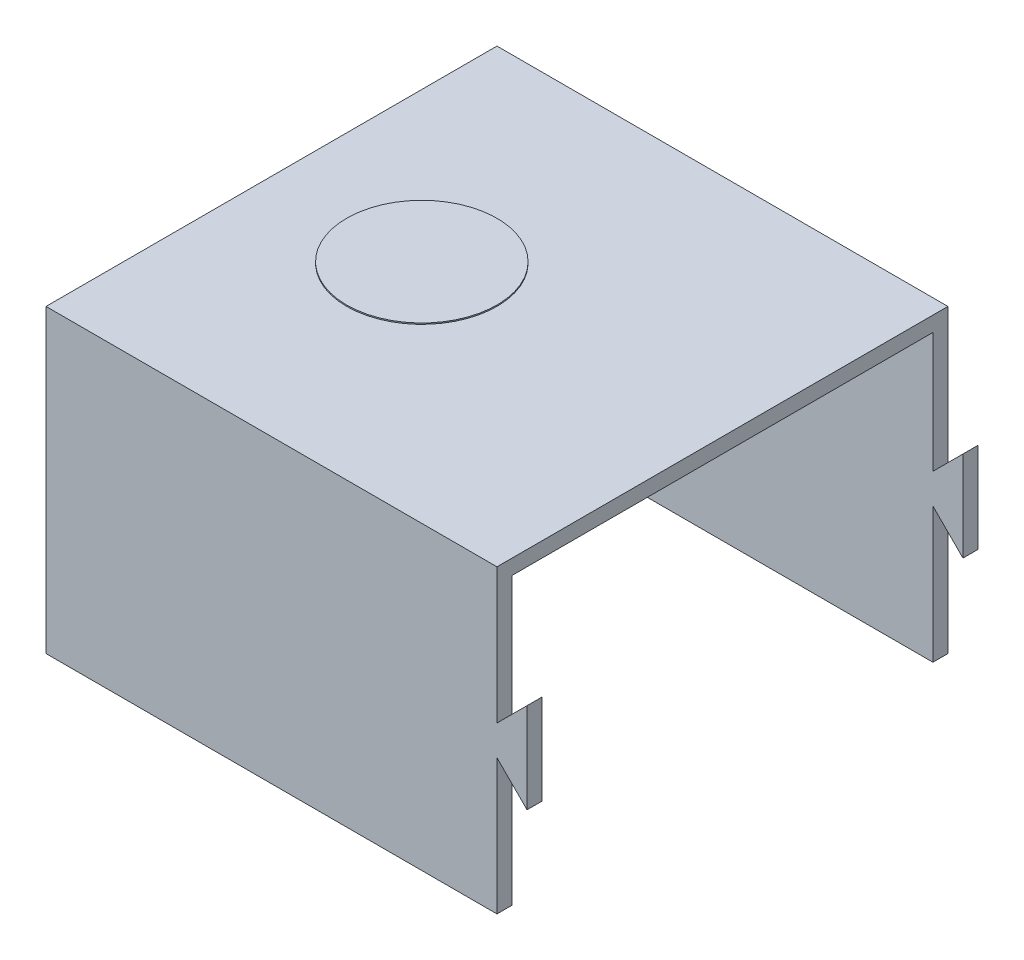
ISO-10303-21;
HEADER;
FILE_DESCRIPTION(('STEP AP214'),'2;1');
FILE_NAME('part.step','',(''),(''),'','','');
FILE_SCHEMA(('AUTOMOTIVE_DESIGN { 1 0 10303 214 1 1 1 1 }'));
ENDSEC;
DATA;
#1=APPLICATION_CONTEXT('core data for automotive mechanical design processes');
#2=APPLICATION_PROTOCOL_DEFINITION('international standard','automotive_design',2000,#1);
#3=PRODUCT_CONTEXT('',#1,'mechanical');
#4=PRODUCT('Part','Part','',(#3));
#5=PRODUCT_RELATED_PRODUCT_CATEGORY('part','',(#4));
#6=PRODUCT_DEFINITION_FORMATION('','',#4);
#7=PRODUCT_DEFINITION_CONTEXT('part definition',#1,'design');
#8=PRODUCT_DEFINITION('design','',#6,#7);
#9=PRODUCT_DEFINITION_SHAPE('','',#8);
#10=(LENGTH_UNIT() NAMED_UNIT(*) SI_UNIT(.MILLI.,.METRE.));
#11=(NAMED_UNIT(*) PLANE_ANGLE_UNIT() SI_UNIT($,.RADIAN.));
#12=(NAMED_UNIT(*) SI_UNIT($,.STERADIAN.) SOLID_ANGLE_UNIT());
#13=UNCERTAINTY_MEASURE_WITH_UNIT(LENGTH_MEASURE(1.E-05),#10,'distance_accuracy_value','');
#14=(GEOMETRIC_REPRESENTATION_CONTEXT(3) GLOBAL_UNCERTAINTY_ASSIGNED_CONTEXT((#13)) GLOBAL_UNIT_ASSIGNED_CONTEXT((#10,
#11,#12)) REPRESENTATION_CONTEXT('',''));
#15=CARTESIAN_POINT('',(0.,0.,0.));
#16=DIRECTION('',(0.,0.,1.));
#17=DIRECTION('',(1.,0.,0.));
#18=AXIS2_PLACEMENT_3D('',#15,#16,#17);
#19=CARTESIAN_POINT('',(31.8706697459584,100.,-58.0254041570439));
#20=DIRECTION('',(-1.,0.,0.));
#21=DIRECTION('',(0.,0.,1.));
#22=AXIS2_PLACEMENT_3D('',#19,#20,#21);
#23=PLANE('',#22);
#24=DIRECTION('',(0.,-1.,0.));
#25=VECTOR('',#24,1.);
#26=CARTESIAN_POINT('',(31.8706697459584,100.,-58.0254041570439));
#27=LINE('',#26,#25);
#28=CARTESIAN_POINT('',(31.8706697459584,45.,-58.0254041570439));
#29=VERTEX_POINT('',#28);
#30=CARTESIAN_POINT('',(31.8706697459584,0.,-58.0254041570439));
#31=VERTEX_POINT('',#30);
#32=EDGE_CURVE('E229',#29,#31,#27,.T.);
#33=ORIENTED_EDGE('',*,*,#32,.F.);
#34=DIRECTION('',(0.,0.,-1.));
#35=VECTOR('',#34,1.);
#36=CARTESIAN_POINT('',(31.8706697459584,45.,-53.0254041570439));
#37=LINE('',#36,#35);
#38=CARTESIAN_POINT('',(31.8706697459584,45.,-53.0254041570439));
#39=VERTEX_POINT('',#38);
#40=EDGE_CURVE('E173',#39,#29,#37,.T.);
#41=ORIENTED_EDGE('',*,*,#40,.F.);
#42=DIRECTION('',(0.,-1.,0.));
#43=VECTOR('',#42,1.);
#44=CARTESIAN_POINT('',(31.8706697459585,95.,-53.0254041570439));
#45=LINE('',#44,#43);
#46=CARTESIAN_POINT('',(31.8706697459585,0.,-53.0254041570439));
#47=VERTEX_POINT('',#46);
#48=EDGE_CURVE('E192',#39,#47,#45,.T.);
#49=ORIENTED_EDGE('',*,*,#48,.T.);
#50=DIRECTION('',(0.,0.,-1.));
#51=VECTOR('',#50,1.);
#52=CARTESIAN_POINT('',(31.8706697459584,0.,-58.0254041570439));
#53=LINE('',#52,#51);
#54=EDGE_CURVE('E223',#47,#31,#53,.T.);
#55=ORIENTED_EDGE('',*,*,#54,.T.);
#56=EDGE_LOOP('',(#33,#41,#49,#55));
#57=FACE_BOUND('',#56,.T.);
#58=ADVANCED_FACE('F39',(#57),#23,.F.);
#59=CARTESIAN_POINT('',(31.8706697459585,95.,-53.0254041570439));
#60=VERTEX_POINT('',#59);
#61=CARTESIAN_POINT('',(31.8706697459584,55.,-53.0254041570439));
#62=VERTEX_POINT('',#61);
#63=EDGE_CURVE('E180',#60,#62,#45,.T.);
#64=ORIENTED_EDGE('',*,*,#63,.T.);
#65=DIRECTION('',(0.,0.,-1.));
#66=VECTOR('',#65,1.);
#67=CARTESIAN_POINT('',(31.8706697459584,55.,-53.0254041570439));
#68=LINE('',#67,#66);
#69=CARTESIAN_POINT('',(31.8706697459584,55.,-58.0254041570439));
#70=VERTEX_POINT('',#69);
#71=EDGE_CURVE('E162',#62,#70,#68,.T.);
#72=ORIENTED_EDGE('',*,*,#71,.T.);
#73=CARTESIAN_POINT('',(31.8706697459584,100.,-58.0254041570439));
#74=VERTEX_POINT('',#73);
#75=EDGE_CURVE('E230',#74,#70,#27,.T.);
#76=ORIENTED_EDGE('',*,*,#75,.F.);
#77=DIRECTION('',(0.,0.,-1.));
#78=VECTOR('',#77,1.);
#79=CARTESIAN_POINT('',(31.8706697459584,100.,-58.0254041570439));
#80=LINE('',#79,#78);
#81=CARTESIAN_POINT('',(31.8706697459584,100.,91.9745958429561));
#82=VERTEX_POINT('',#81);
#83=EDGE_CURVE('E214',#82,#74,#80,.T.);
#84=ORIENTED_EDGE('',*,*,#83,.F.);
#85=DIRECTION('',(0.,-1.,0.));
#86=VECTOR('',#85,1.);
#87=CARTESIAN_POINT('',(31.8706697459584,100.,91.9745958429561));
#88=LINE('',#87,#86);
#89=CARTESIAN_POINT('',(31.8706697459584,55.,91.9745958429561));
#90=VERTEX_POINT('',#89);
#91=EDGE_CURVE('E47',#82,#90,#88,.T.);
#92=ORIENTED_EDGE('',*,*,#91,.T.);
#93=DIRECTION('',(0.,0.,1.));
#94=VECTOR('',#93,1.);
#95=CARTESIAN_POINT('',(31.8706697459584,55.,86.9745958429561));
#96=LINE('',#95,#94);
#97=CARTESIAN_POINT('',(31.8706697459584,55.,86.9745958429561));
#98=VERTEX_POINT('',#97);
#99=EDGE_CURVE('E253',#98,#90,#96,.T.);
#100=ORIENTED_EDGE('',*,*,#99,.F.);
#101=DIRECTION('',(0.,-1.,0.));
#102=VECTOR('',#101,1.);
#103=CARTESIAN_POINT('',(31.8706697459584,95.,86.9745958429561));
#104=LINE('',#103,#102);
#105=CARTESIAN_POINT('',(31.8706697459584,95.,86.9745958429561));
#106=VERTEX_POINT('',#105);
#107=EDGE_CURVE('E205',#106,#98,#104,.T.);
#108=ORIENTED_EDGE('',*,*,#107,.F.);
#109=DIRECTION('',(0.,0.,1.));
#110=VECTOR('',#109,1.);
#111=CARTESIAN_POINT('',(31.8706697459584,95.,86.9745958429561));
#112=LINE('',#111,#110);
#113=EDGE_CURVE('E190',#60,#106,#112,.T.);
#114=ORIENTED_EDGE('',*,*,#113,.F.);
#115=EDGE_LOOP('',(#64,#72,#76,#84,#92,#100,#108,#114));
#116=FACE_BOUND('',#115,.T.);
#117=ADVANCED_FACE('F187',(#116),#23,.F.);
#118=CARTESIAN_POINT('',(-118.129330254042,100.,-58.0254041570439));
#119=DIRECTION('',(1.,0.,0.));
#120=DIRECTION('',(0.,0.,-1.));
#121=AXIS2_PLACEMENT_3D('',#118,#119,#120);
#122=PLANE('',#121);
#123=DIRECTION('',(0.,0.,1.));
#124=VECTOR('',#123,1.);
#125=CARTESIAN_POINT('',(-118.129330254042,0.,-58.0254041570439));
#126=LINE('',#125,#124);
#127=CARTESIAN_POINT('',(-118.129330254042,0.,-58.0254041570439));
#128=VERTEX_POINT('',#127);
#129=CARTESIAN_POINT('',(-118.129330254042,0.,91.9745958429561));
#130=VERTEX_POINT('',#129);
#131=EDGE_CURVE('E209',#128,#130,#126,.T.);
#132=ORIENTED_EDGE('',*,*,#131,.T.);
#133=DIRECTION('',(0.,-1.,0.));
#134=VECTOR('',#133,1.);
#135=CARTESIAN_POINT('',(-118.129330254042,100.,91.9745958429561));
#136=LINE('',#135,#134);
#137=CARTESIAN_POINT('',(-118.129330254042,100.,91.9745958429561));
#138=VERTEX_POINT('',#137);
#139=EDGE_CURVE('E11',#138,#130,#136,.T.);
#140=ORIENTED_EDGE('',*,*,#139,.F.);
#141=DIRECTION('',(0.,0.,1.));
#142=VECTOR('',#141,1.);
#143=CARTESIAN_POINT('',(-118.129330254042,100.,-58.0254041570439));
#144=LINE('',#143,#142);
#145=CARTESIAN_POINT('',(-118.129330254042,100.,-58.0254041570439));
#146=VERTEX_POINT('',#145);
#147=EDGE_CURVE('E211',#146,#138,#144,.T.);
#148=ORIENTED_EDGE('',*,*,#147,.F.);
#149=DIRECTION('',(0.,-1.,0.));
#150=VECTOR('',#149,1.);
#151=CARTESIAN_POINT('',(-118.129330254042,100.,-58.0254041570439));
#152=LINE('',#151,#150);
#153=EDGE_CURVE('E217',#146,#128,#152,.T.);
#154=ORIENTED_EDGE('',*,*,#153,.T.);
#155=EDGE_LOOP('',(#132,#140,#148,#154));
#156=FACE_BOUND('',#155,.T.);
#157=ADVANCED_FACE('F41',(#156),#122,.F.);
#158=CARTESIAN_POINT('',(-118.129330254042,100.,91.9745958429561));
#159=DIRECTION('',(0.,0.,-1.));
#160=DIRECTION('',(-1.,0.,0.));
#161=AXIS2_PLACEMENT_3D('',#158,#159,#160);
#162=PLANE('',#161);
#163=DIRECTION('',(1.,0.,0.));
#164=VECTOR('',#163,1.);
#165=CARTESIAN_POINT('',(-118.129330254042,0.,91.9745958429561));
#166=LINE('',#165,#164);
#167=CARTESIAN_POINT('',(31.8706697459584,0.,91.9745958429561));
#168=VERTEX_POINT('',#167);
#169=EDGE_CURVE('E220',#130,#168,#166,.T.);
#170=ORIENTED_EDGE('',*,*,#169,.T.);
#171=CARTESIAN_POINT('',(31.8706697459584,45.,91.9745958429561));
#172=VERTEX_POINT('',#171);
#173=EDGE_CURVE('E231',#172,#168,#88,.T.);
#174=ORIENTED_EDGE('',*,*,#173,.F.);
#175=DIRECTION('',(0.707106781186552,-0.707106781186543,0.));
#176=VECTOR('',#175,1.);
#177=CARTESIAN_POINT('',(41.8706697459584,35.0000000000001,91.9745958429561));
#178=LINE('',#177,#176);
#179=CARTESIAN_POINT('',(41.8706697459584,35.0000000000001,91.9745958429561));
#180=VERTEX_POINT('',#179);
#181=EDGE_CURVE('E275',#172,#180,#178,.T.);
#182=ORIENTED_EDGE('',*,*,#181,.T.);
#183=DIRECTION('',(0.,1.,0.));
#184=VECTOR('',#183,1.);
#185=CARTESIAN_POINT('',(41.8706697459584,55.,91.9745958429561));
#186=LINE('',#185,#184);
#187=CARTESIAN_POINT('',(41.8706697459584,64.9999999999999,91.9745958429561));
#188=VERTEX_POINT('',#187);
#189=EDGE_CURVE('E268',#180,#188,#186,.T.);
#190=ORIENTED_EDGE('',*,*,#189,.T.);
#191=DIRECTION('',(-0.707106781186551,-0.707106781186544,0.));
#192=VECTOR('',#191,1.);
#193=CARTESIAN_POINT('',(31.8706697459584,55.,91.9745958429561));
#194=LINE('',#193,#192);
#195=EDGE_CURVE('E278',#188,#90,#194,.T.);
#196=ORIENTED_EDGE('',*,*,#195,.T.);
#197=ORIENTED_EDGE('',*,*,#91,.F.);
#198=DIRECTION('',(1.,0.,0.));
#199=VECTOR('',#198,1.);
#200=CARTESIAN_POINT('',(-118.129330254042,100.,91.9745958429561));
#201=LINE('',#200,#199);
#202=EDGE_CURVE('E90',#138,#82,#201,.T.);
#203=ORIENTED_EDGE('',*,*,#202,.F.);
#204=ORIENTED_EDGE('',*,*,#139,.T.);
#205=EDGE_LOOP('',(#170,#174,#182,#190,#196,#197,#203,#204));
#206=FACE_BOUND('',#205,.T.);
#207=ADVANCED_FACE('F242',(#206),#162,.F.);
#208=CARTESIAN_POINT('',(31.8706697459584,45.,86.9745958429561));
#209=VERTEX_POINT('',#208);
#210=CARTESIAN_POINT('',(31.8706697459584,0.,86.9745958429561));
#211=VERTEX_POINT('',#210);
#212=EDGE_CURVE('E54',#209,#211,#104,.T.);
#213=ORIENTED_EDGE('',*,*,#212,.F.);
#214=DIRECTION('',(0.,0.,1.));
#215=VECTOR('',#214,1.);
#216=CARTESIAN_POINT('',(31.8706697459584,45.,86.9745958429561));
#217=LINE('',#216,#215);
#218=EDGE_CURVE('E240',#209,#172,#217,.T.);
#219=ORIENTED_EDGE('',*,*,#218,.T.);
#220=ORIENTED_EDGE('',*,*,#173,.T.);
#221=EDGE_CURVE('E224',#168,#211,#53,.T.);
#222=ORIENTED_EDGE('',*,*,#221,.T.);
#223=EDGE_LOOP('',(#213,#219,#220,#222));
#224=FACE_BOUND('',#223,.T.);
#225=ADVANCED_FACE('F238',(#224),#23,.F.);
#226=CARTESIAN_POINT('',(-118.129330254042,100.,-58.0254041570439));
#227=DIRECTION('',(0.,0.,1.));
#228=DIRECTION('',(1.,0.,0.));
#229=AXIS2_PLACEMENT_3D('',#226,#227,#228);
#230=PLANE('',#229);
#231=DIRECTION('',(-1.,0.,0.));
#232=VECTOR('',#231,1.);
#233=CARTESIAN_POINT('',(-118.129330254042,0.,-58.0254041570439));
#234=LINE('',#233,#232);
#235=EDGE_CURVE('E83',#31,#128,#234,.T.);
#236=ORIENTED_EDGE('',*,*,#235,.T.);
#237=ORIENTED_EDGE('',*,*,#153,.F.);
#238=DIRECTION('',(-1.,0.,0.));
#239=VECTOR('',#238,1.);
#240=CARTESIAN_POINT('',(-118.129330254042,100.,-58.0254041570439));
#241=LINE('',#240,#239);
#242=EDGE_CURVE('E63',#74,#146,#241,.T.);
#243=ORIENTED_EDGE('',*,*,#242,.F.);
#244=ORIENTED_EDGE('',*,*,#75,.T.);
#245=DIRECTION('',(0.707106781186552,0.707106781186543,0.));
#246=VECTOR('',#245,1.);
#247=CARTESIAN_POINT('',(31.8706697459584,55.,-58.0254041570439));
#248=LINE('',#247,#246);
#249=CARTESIAN_POINT('',(41.8706697459584,64.9999999999999,-58.0254041570439));
#250=VERTEX_POINT('',#249);
#251=EDGE_CURVE('E168',#70,#250,#248,.T.);
#252=ORIENTED_EDGE('',*,*,#251,.T.);
#253=DIRECTION('',(0.,-1.,0.));
#254=VECTOR('',#253,1.);
#255=CARTESIAN_POINT('',(41.8706697459584,55.,-58.0254041570439));
#256=LINE('',#255,#254);
#257=CARTESIAN_POINT('',(41.8706697459584,35.0000000000001,-58.0254041570439));
#258=VERTEX_POINT('',#257);
#259=EDGE_CURVE('E288',#250,#258,#256,.T.);
#260=ORIENTED_EDGE('',*,*,#259,.T.);
#261=DIRECTION('',(-0.707106781186551,0.707106781186544,0.));
#262=VECTOR('',#261,1.);
#263=CARTESIAN_POINT('',(41.8706697459584,35.0000000000001,-58.0254041570439));
#264=LINE('',#263,#262);
#265=EDGE_CURVE('E293',#258,#29,#264,.T.);
#266=ORIENTED_EDGE('',*,*,#265,.T.);
#267=ORIENTED_EDGE('',*,*,#32,.T.);
#268=EDGE_LOOP('',(#236,#237,#243,#244,#252,#260,#266,#267));
#269=FACE_BOUND('',#268,.T.);
#270=ADVANCED_FACE('F300',(#269),#230,.F.);
#271=CARTESIAN_POINT('',(0.,100.,0.));
#272=DIRECTION('',(0.,1.,0.));
#273=DIRECTION('',(0.,0.,1.));
#274=AXIS2_PLACEMENT_3D('',#271,#272,#273);
#275=PLANE('',#274);
#276=CARTESIAN_POINT('',(-68.1293302540416,100.,16.9745958429561));
#277=DIRECTION('',(0.,1.,0.));
#278=DIRECTION('',(0.,0.,1.));
#279=AXIS2_PLACEMENT_3D('',#276,#277,#278);
#280=CIRCLE('',#279,25.);
#281=CARTESIAN_POINT('',(-68.1293302540416,100.,41.9745958429561));
#282=VERTEX_POINT('',#281);
#283=EDGE_CURVE('E191',#282,#282,#280,.T.);
#284=ORIENTED_EDGE('',*,*,#283,.F.);
#285=EDGE_LOOP('',(#284));
#286=FACE_BOUND('',#285,.T.);
#287=ORIENTED_EDGE('',*,*,#147,.T.);
#288=ORIENTED_EDGE('',*,*,#202,.T.);
#289=ORIENTED_EDGE('',*,*,#83,.T.);
#290=ORIENTED_EDGE('',*,*,#242,.T.);
#291=EDGE_LOOP('',(#287,#288,#289,#290));
#292=FACE_BOUND('',#291,.T.);
#293=ADVANCED_FACE('F301',(#286,#292),#275,.T.);
#294=CARTESIAN_POINT('',(0.,0.,0.));
#295=DIRECTION('',(0.,1.,0.));
#296=DIRECTION('',(0.,0.,1.));
#297=AXIS2_PLACEMENT_3D('',#294,#295,#296);
#298=PLANE('',#297);
#299=ORIENTED_EDGE('',*,*,#54,.F.);
#300=DIRECTION('',(1.,0.,0.));
#301=VECTOR('',#300,1.);
#302=CARTESIAN_POINT('',(31.8706697459585,0.,-53.0254041570439));
#303=LINE('',#302,#301);
#304=CARTESIAN_POINT('',(-113.129330254042,0.,-53.0254041570439));
#305=VERTEX_POINT('',#304);
#306=EDGE_CURVE('E200',#305,#47,#303,.T.);
#307=ORIENTED_EDGE('',*,*,#306,.F.);
#308=DIRECTION('',(0.,0.,-1.));
#309=VECTOR('',#308,1.);
#310=CARTESIAN_POINT('',(-113.129330254042,0.,86.9745958429561));
#311=LINE('',#310,#309);
#312=CARTESIAN_POINT('',(-113.129330254042,0.,86.9745958429561));
#313=VERTEX_POINT('',#312);
#314=EDGE_CURVE('E252',#313,#305,#311,.T.);
#315=ORIENTED_EDGE('',*,*,#314,.F.);
#316=DIRECTION('',(-1.,0.,0.));
#317=VECTOR('',#316,1.);
#318=CARTESIAN_POINT('',(31.8706697459584,0.,86.9745958429561));
#319=LINE('',#318,#317);
#320=EDGE_CURVE('E249',#211,#313,#319,.T.);
#321=ORIENTED_EDGE('',*,*,#320,.F.);
#322=ORIENTED_EDGE('',*,*,#221,.F.);
#323=ORIENTED_EDGE('',*,*,#169,.F.);
#324=ORIENTED_EDGE('',*,*,#131,.F.);
#325=ORIENTED_EDGE('',*,*,#235,.F.);
#326=EDGE_LOOP('',(#299,#307,#315,#321,#322,#323,#324,#325));
#327=FACE_BOUND('',#326,.T.);
#328=ADVANCED_FACE('F247',(#327),#298,.F.);
#329=CARTESIAN_POINT('',(-68.1293302540416,100.4,16.9745958429561));
#330=DIRECTION('',(0.,-1.,0.));
#331=DIRECTION('',(0.,0.,-1.));
#332=AXIS2_PLACEMENT_3D('',#329,#330,#331);
#333=CYLINDRICAL_SURFACE('',#332,25.);
#334=CARTESIAN_POINT('',(-68.1293302540416,100.4,16.9745958429561));
#335=DIRECTION('',(0.,1.,0.));
#336=DIRECTION('',(0.,0.,1.));
#337=AXIS2_PLACEMENT_3D('',#334,#335,#336);
#338=CIRCLE('',#337,25.);
#339=CARTESIAN_POINT('',(-68.1293302540416,100.4,41.9745958429561));
#340=VERTEX_POINT('',#339);
#341=EDGE_CURVE('E195',#340,#340,#338,.T.);
#342=ORIENTED_EDGE('',*,*,#341,.F.);
#343=EDGE_LOOP('',(#342));
#344=FACE_BOUND('',#343,.T.);
#345=ORIENTED_EDGE('',*,*,#283,.T.);
#346=EDGE_LOOP('',(#345));
#347=FACE_BOUND('',#346,.T.);
#348=ADVANCED_FACE('F370',(#344,#347),#333,.T.);
#349=CARTESIAN_POINT('',(-68.1293302540416,100.4,16.9745958429561));
#350=DIRECTION('',(0.,1.,0.));
#351=DIRECTION('',(0.,0.,1.));
#352=AXIS2_PLACEMENT_3D('',#349,#350,#351);
#353=PLANE('',#352);
#354=ORIENTED_EDGE('',*,*,#341,.T.);
#355=EDGE_LOOP('',(#354));
#356=FACE_BOUND('',#355,.T.);
#357=ADVANCED_FACE('F374',(#356),#353,.T.);
#358=CARTESIAN_POINT('',(31.8706697459585,95.,-53.0254041570439));
#359=DIRECTION('',(0.,0.,-1.));
#360=DIRECTION('',(-1.,0.,0.));
#361=AXIS2_PLACEMENT_3D('',#358,#359,#360);
#362=PLANE('',#361);
#363=ORIENTED_EDGE('',*,*,#306,.T.);
#364=ORIENTED_EDGE('',*,*,#48,.F.);
#365=DIRECTION('',(-0.707106781186551,0.707106781186544,0.));
#366=VECTOR('',#365,1.);
#367=CARTESIAN_POINT('',(41.8706697459584,35.0000000000001,-53.0254041570439));
#368=LINE('',#367,#366);
#369=CARTESIAN_POINT('',(41.8706697459584,35.0000000000001,-53.0254041570439));
#370=VERTEX_POINT('',#369);
#371=EDGE_CURVE('E291',#370,#39,#368,.T.);
#372=ORIENTED_EDGE('',*,*,#371,.F.);
#373=DIRECTION('',(0.,-1.,0.));
#374=VECTOR('',#373,1.);
#375=CARTESIAN_POINT('',(41.8706697459584,55.,-53.0254041570439));
#376=LINE('',#375,#374);
#377=CARTESIAN_POINT('',(41.8706697459584,64.9999999999999,-53.0254041570439));
#378=VERTEX_POINT('',#377);
#379=EDGE_CURVE('E174',#378,#370,#376,.T.);
#380=ORIENTED_EDGE('',*,*,#379,.F.);
#381=DIRECTION('',(0.707106781186552,0.707106781186543,0.));
#382=VECTOR('',#381,1.);
#383=CARTESIAN_POINT('',(31.8706697459584,55.,-53.0254041570439));
#384=LINE('',#383,#382);
#385=EDGE_CURVE('E166',#62,#378,#384,.T.);
#386=ORIENTED_EDGE('',*,*,#385,.F.);
#387=ORIENTED_EDGE('',*,*,#63,.F.);
#388=DIRECTION('',(1.,0.,0.));
#389=VECTOR('',#388,1.);
#390=CARTESIAN_POINT('',(31.8706697459585,95.,-53.0254041570439));
#391=LINE('',#390,#389);
#392=CARTESIAN_POINT('',(-113.129330254042,95.,-53.0254041570439));
#393=VERTEX_POINT('',#392);
#394=EDGE_CURVE('E257',#393,#60,#391,.T.);
#395=ORIENTED_EDGE('',*,*,#394,.F.);
#396=DIRECTION('',(0.,-1.,0.));
#397=VECTOR('',#396,1.);
#398=CARTESIAN_POINT('',(-113.129330254042,95.,-53.0254041570439));
#399=LINE('',#398,#397);
#400=EDGE_CURVE('E197',#393,#305,#399,.T.);
#401=ORIENTED_EDGE('',*,*,#400,.T.);
#402=EDGE_LOOP('',(#363,#364,#372,#380,#386,#387,#395,#401));
#403=FACE_BOUND('',#402,.T.);
#404=ADVANCED_FACE('F178',(#403),#362,.F.);
#405=CARTESIAN_POINT('',(-113.129330254042,95.,86.9745958429561));
#406=DIRECTION('',(-1.,0.,0.));
#407=DIRECTION('',(0.,0.,1.));
#408=AXIS2_PLACEMENT_3D('',#405,#406,#407);
#409=PLANE('',#408);
#410=ORIENTED_EDGE('',*,*,#314,.T.);
#411=ORIENTED_EDGE('',*,*,#400,.F.);
#412=DIRECTION('',(0.,0.,-1.));
#413=VECTOR('',#412,1.);
#414=CARTESIAN_POINT('',(-113.129330254042,95.,86.9745958429561));
#415=LINE('',#414,#413);
#416=CARTESIAN_POINT('',(-113.129330254042,95.,86.9745958429561));
#417=VERTEX_POINT('',#416);
#418=EDGE_CURVE('E259',#417,#393,#415,.T.);
#419=ORIENTED_EDGE('',*,*,#418,.F.);
#420=DIRECTION('',(0.,-1.,0.));
#421=VECTOR('',#420,1.);
#422=CARTESIAN_POINT('',(-113.129330254042,95.,86.9745958429561));
#423=LINE('',#422,#421);
#424=EDGE_CURVE('E203',#417,#313,#423,.T.);
#425=ORIENTED_EDGE('',*,*,#424,.T.);
#426=EDGE_LOOP('',(#410,#411,#419,#425));
#427=FACE_BOUND('',#426,.T.);
#428=ADVANCED_FACE('F314',(#427),#409,.F.);
#429=CARTESIAN_POINT('',(31.8706697459584,95.,86.9745958429561));
#430=DIRECTION('',(0.,0.,1.));
#431=DIRECTION('',(1.,0.,0.));
#432=AXIS2_PLACEMENT_3D('',#429,#430,#431);
#433=PLANE('',#432);
#434=ORIENTED_EDGE('',*,*,#320,.T.);
#435=ORIENTED_EDGE('',*,*,#424,.F.);
#436=DIRECTION('',(-1.,0.,0.));
#437=VECTOR('',#436,1.);
#438=CARTESIAN_POINT('',(31.8706697459584,95.,86.9745958429561));
#439=LINE('',#438,#437);
#440=EDGE_CURVE('E262',#106,#417,#439,.T.);
#441=ORIENTED_EDGE('',*,*,#440,.F.);
#442=ORIENTED_EDGE('',*,*,#107,.T.);
#443=DIRECTION('',(-0.707106781186551,-0.707106781186544,0.));
#444=VECTOR('',#443,1.);
#445=CARTESIAN_POINT('',(31.8706697459584,55.,86.9745958429561));
#446=LINE('',#445,#444);
#447=CARTESIAN_POINT('',(41.8706697459584,64.9999999999999,86.9745958429561));
#448=VERTEX_POINT('',#447);
#449=EDGE_CURVE('E283',#448,#98,#446,.T.);
#450=ORIENTED_EDGE('',*,*,#449,.F.);
#451=DIRECTION('',(0.,1.,0.));
#452=VECTOR('',#451,1.);
#453=CARTESIAN_POINT('',(41.8706697459584,55.,86.9745958429561));
#454=LINE('',#453,#452);
#455=CARTESIAN_POINT('',(41.8706697459584,35.0000000000001,86.9745958429561));
#456=VERTEX_POINT('',#455);
#457=EDGE_CURVE('E266',#456,#448,#454,.T.);
#458=ORIENTED_EDGE('',*,*,#457,.F.);
#459=DIRECTION('',(0.707106781186552,-0.707106781186543,0.));
#460=VECTOR('',#459,1.);
#461=CARTESIAN_POINT('',(41.8706697459584,35.0000000000001,86.9745958429561));
#462=LINE('',#461,#460);
#463=EDGE_CURVE('E272',#209,#456,#462,.T.);
#464=ORIENTED_EDGE('',*,*,#463,.F.);
#465=ORIENTED_EDGE('',*,*,#212,.T.);
#466=EDGE_LOOP('',(#434,#435,#441,#442,#450,#458,#464,#465));
#467=FACE_BOUND('',#466,.T.);
#468=ADVANCED_FACE('F308',(#467),#433,.F.);
#469=CARTESIAN_POINT('',(0.,95.,0.));
#470=DIRECTION('',(0.,1.,0.));
#471=DIRECTION('',(0.,0.,1.));
#472=AXIS2_PLACEMENT_3D('',#469,#470,#471);
#473=PLANE('',#472);
#474=ORIENTED_EDGE('',*,*,#113,.T.);
#475=ORIENTED_EDGE('',*,*,#440,.T.);
#476=ORIENTED_EDGE('',*,*,#418,.T.);
#477=ORIENTED_EDGE('',*,*,#394,.T.);
#478=EDGE_LOOP('',(#474,#475,#476,#477));
#479=FACE_BOUND('',#478,.T.);
#480=ADVANCED_FACE('F311',(#479),#473,.F.);
#481=CARTESIAN_POINT('',(41.8706697459584,55.,86.9745958429561));
#482=DIRECTION('',(1.,0.,0.));
#483=DIRECTION('',(0.,0.,-1.));
#484=AXIS2_PLACEMENT_3D('',#481,#482,#483);
#485=PLANE('',#484);
#486=ORIENTED_EDGE('',*,*,#189,.F.);
#487=DIRECTION('',(0.,0.,1.));
#488=VECTOR('',#487,1.);
#489=CARTESIAN_POINT('',(41.8706697459584,35.0000000000001,86.9745958429561));
#490=LINE('',#489,#488);
#491=EDGE_CURVE('E276',#456,#180,#490,.T.);
#492=ORIENTED_EDGE('',*,*,#491,.F.);
#493=ORIENTED_EDGE('',*,*,#457,.T.);
#494=DIRECTION('',(0.,0.,1.));
#495=VECTOR('',#494,1.);
#496=CARTESIAN_POINT('',(41.8706697459584,64.9999999999999,86.9745958429561));
#497=LINE('',#496,#495);
#498=EDGE_CURVE('E270',#448,#188,#497,.T.);
#499=ORIENTED_EDGE('',*,*,#498,.T.);
#500=EDGE_LOOP('',(#486,#492,#493,#499));
#501=FACE_BOUND('',#500,.T.);
#502=ADVANCED_FACE('F404',(#501),#485,.T.);
#503=CARTESIAN_POINT('',(41.8706697459584,35.0000000000001,86.9745958429561));
#504=DIRECTION('',(-0.707106781186543,-0.707106781186552,0.));
#505=DIRECTION('',(0.707106781186552,-0.707106781186543,0.));
#506=AXIS2_PLACEMENT_3D('',#503,#504,#505);
#507=PLANE('',#506);
#508=ORIENTED_EDGE('',*,*,#181,.F.);
#509=ORIENTED_EDGE('',*,*,#218,.F.);
#510=ORIENTED_EDGE('',*,*,#463,.T.);
#511=ORIENTED_EDGE('',*,*,#491,.T.);
#512=EDGE_LOOP('',(#508,#509,#510,#511));
#513=FACE_BOUND('',#512,.T.);
#514=ADVANCED_FACE('F333',(#513),#507,.T.);
#515=CARTESIAN_POINT('',(31.8706697459584,55.,86.9745958429561));
#516=DIRECTION('',(-0.707106781186544,0.707106781186551,0.));
#517=DIRECTION('',(-0.707106781186551,-0.707106781186544,0.));
#518=AXIS2_PLACEMENT_3D('',#515,#516,#517);
#519=PLANE('',#518);
#520=ORIENTED_EDGE('',*,*,#195,.F.);
#521=ORIENTED_EDGE('',*,*,#498,.F.);
#522=ORIENTED_EDGE('',*,*,#449,.T.);
#523=ORIENTED_EDGE('',*,*,#99,.T.);
#524=EDGE_LOOP('',(#520,#521,#522,#523));
#525=FACE_BOUND('',#524,.T.);
#526=ADVANCED_FACE('F306',(#525),#519,.T.);
#527=CARTESIAN_POINT('',(41.8706697459584,55.,-53.0254041570439));
#528=DIRECTION('',(1.,0.,0.));
#529=DIRECTION('',(0.,0.,-1.));
#530=AXIS2_PLACEMENT_3D('',#527,#528,#529);
#531=PLANE('',#530);
#532=ORIENTED_EDGE('',*,*,#259,.F.);
#533=DIRECTION('',(0.,0.,-1.));
#534=VECTOR('',#533,1.);
#535=CARTESIAN_POINT('',(41.8706697459584,64.9999999999999,-53.0254041570439));
#536=LINE('',#535,#534);
#537=EDGE_CURVE('E184',#378,#250,#536,.T.);
#538=ORIENTED_EDGE('',*,*,#537,.F.);
#539=ORIENTED_EDGE('',*,*,#379,.T.);
#540=DIRECTION('',(0.,0.,-1.));
#541=VECTOR('',#540,1.);
#542=CARTESIAN_POINT('',(41.8706697459584,35.0000000000001,-53.0254041570439));
#543=LINE('',#542,#541);
#544=EDGE_CURVE('E294',#370,#258,#543,.T.);
#545=ORIENTED_EDGE('',*,*,#544,.T.);
#546=EDGE_LOOP('',(#532,#538,#539,#545));
#547=FACE_BOUND('',#546,.T.);
#548=ADVANCED_FACE('F324',(#547),#531,.T.);
#549=CARTESIAN_POINT('',(31.8706697459584,55.,-53.0254041570439));
#550=DIRECTION('',(-0.707106781186543,0.707106781186552,0.));
#551=DIRECTION('',(-0.707106781186552,-0.707106781186543,0.));
#552=AXIS2_PLACEMENT_3D('',#549,#550,#551);
#553=PLANE('',#552);
#554=ORIENTED_EDGE('',*,*,#251,.F.);
#555=ORIENTED_EDGE('',*,*,#71,.F.);
#556=ORIENTED_EDGE('',*,*,#385,.T.);
#557=ORIENTED_EDGE('',*,*,#537,.T.);
#558=EDGE_LOOP('',(#554,#555,#556,#557));
#559=FACE_BOUND('',#558,.T.);
#560=ADVANCED_FACE('F164',(#559),#553,.T.);
#561=CARTESIAN_POINT('',(41.8706697459584,35.0000000000001,-53.0254041570439));
#562=DIRECTION('',(-0.707106781186544,-0.707106781186551,0.));
#563=DIRECTION('',(0.707106781186551,-0.707106781186544,0.));
#564=AXIS2_PLACEMENT_3D('',#561,#562,#563);
#565=PLANE('',#564);
#566=ORIENTED_EDGE('',*,*,#265,.F.);
#567=ORIENTED_EDGE('',*,*,#544,.F.);
#568=ORIENTED_EDGE('',*,*,#371,.T.);
#569=ORIENTED_EDGE('',*,*,#40,.T.);
#570=EDGE_LOOP('',(#566,#567,#568,#569));
#571=FACE_BOUND('',#570,.T.);
#572=ADVANCED_FACE('F322',(#571),#565,.T.);
#573=CLOSED_SHELL('',(#58,#117,#157,#207,#225,#270,#293,#328,#348,#357,#404,#428,#468,#480,#502,
#514,#526,#548,#560,#572));
#574=MANIFOLD_SOLID_BREP('B2',#573);
#575=ADVANCED_BREP_SHAPE_REPRESENTATION('',(#18,#574),#14);
#576=SHAPE_DEFINITION_REPRESENTATION(#9,#575);
ENDSEC;
END-ISO-10303-21;
